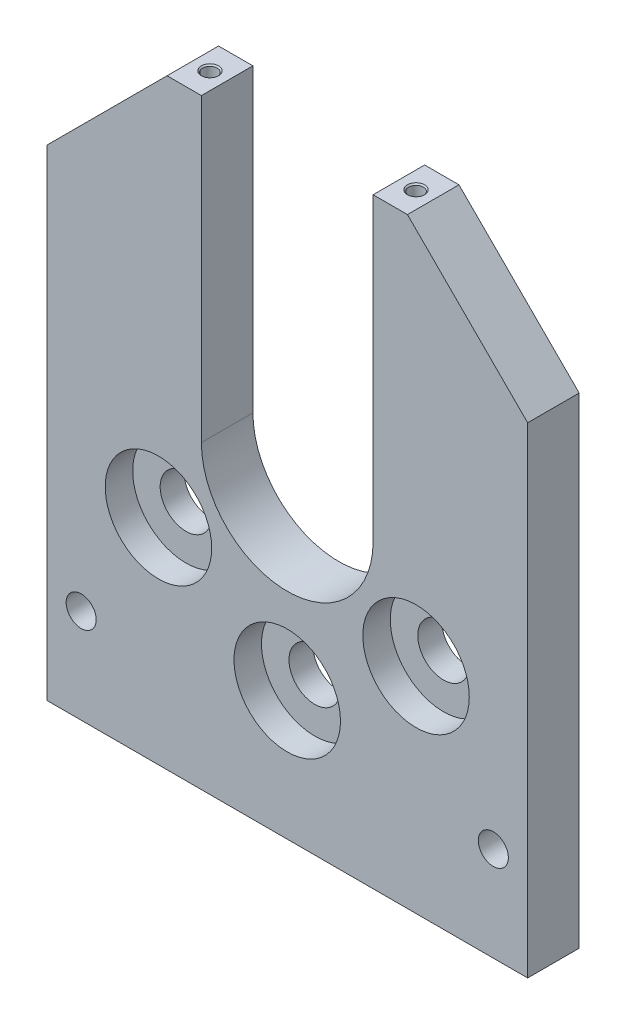
ISO-10303-21;
HEADER;
FILE_DESCRIPTION(('STEP AP214'),'2;1');
FILE_NAME('part.step','',(''),(''),'','','');
FILE_SCHEMA(('AUTOMOTIVE_DESIGN { 1 0 10303 214 1 1 1 1 }'));
ENDSEC;
DATA;
#1=APPLICATION_CONTEXT('core data for automotive mechanical design processes');
#2=APPLICATION_PROTOCOL_DEFINITION('international standard','automotive_design',2000,#1);
#3=PRODUCT_CONTEXT('',#1,'mechanical');
#4=PRODUCT('Part','Part','',(#3));
#5=PRODUCT_RELATED_PRODUCT_CATEGORY('part','',(#4));
#6=PRODUCT_DEFINITION_FORMATION('','',#4);
#7=PRODUCT_DEFINITION_CONTEXT('part definition',#1,'design');
#8=PRODUCT_DEFINITION('design','',#6,#7);
#9=PRODUCT_DEFINITION_SHAPE('','',#8);
#10=(LENGTH_UNIT() NAMED_UNIT(*) SI_UNIT(.MILLI.,.METRE.));
#11=(NAMED_UNIT(*) PLANE_ANGLE_UNIT() SI_UNIT($,.RADIAN.));
#12=(NAMED_UNIT(*) SI_UNIT($,.STERADIAN.) SOLID_ANGLE_UNIT());
#13=UNCERTAINTY_MEASURE_WITH_UNIT(LENGTH_MEASURE(1.E-05),#10,'distance_accuracy_value','');
#14=(GEOMETRIC_REPRESENTATION_CONTEXT(3) GLOBAL_UNCERTAINTY_ASSIGNED_CONTEXT((#13)) GLOBAL_UNIT_ASSIGNED_CONTEXT((#10,
#11,#12)) REPRESENTATION_CONTEXT('',''));
#15=CARTESIAN_POINT('',(0.,0.,0.));
#16=DIRECTION('',(0.,0.,1.));
#17=DIRECTION('',(1.,0.,0.));
#18=AXIS2_PLACEMENT_3D('',#15,#16,#17);
#19=CARTESIAN_POINT('',(0.,75.,-335.));
#20=DIRECTION('',(0.,0.,1.));
#21=DIRECTION('',(1.,0.,0.));
#22=AXIS2_PLACEMENT_3D('',#19,#20,#21);
#23=CYLINDRICAL_SURFACE('',#22,15.);
#24=CARTESIAN_POINT('',(0.,75.,-15.));
#25=DIRECTION('',(0.,0.,1.));
#26=DIRECTION('',(1.,0.,0.));
#27=AXIS2_PLACEMENT_3D('',#24,#25,#26);
#28=CIRCLE('',#27,15.);
#29=CARTESIAN_POINT('',(15.,75.,-15.));
#30=VERTEX_POINT('',#29);
#31=EDGE_CURVE('E227',#30,#30,#28,.T.);
#32=ORIENTED_EDGE('',*,*,#31,.F.);
#33=EDGE_LOOP('',(#32));
#34=FACE_BOUND('',#33,.T.);
#35=CARTESIAN_POINT('',(0.,75.,-1.));
#36=DIRECTION('',(0.,0.,1.));
#37=DIRECTION('',(1.,0.,0.));
#38=AXIS2_PLACEMENT_3D('',#35,#36,#37);
#39=CIRCLE('',#38,15.);
#40=CARTESIAN_POINT('',(15.,75.,-1.));
#41=VERTEX_POINT('',#40);
#42=EDGE_CURVE('E49',#41,#41,#39,.F.);
#43=ORIENTED_EDGE('',*,*,#42,.F.);
#44=EDGE_LOOP('',(#43));
#45=FACE_BOUND('',#44,.T.);
#46=ADVANCED_FACE('F44',(#34,#45),#23,.F.);
#47=CARTESIAN_POINT('',(75.,124.749371855331,-335.));
#48=DIRECTION('',(0.,0.,1.));
#49=DIRECTION('',(1.,0.,0.));
#50=AXIS2_PLACEMENT_3D('',#47,#48,#49);
#51=CYLINDRICAL_SURFACE('',#50,15.);
#52=CARTESIAN_POINT('',(75.,124.749371855331,-15.));
#53=DIRECTION('',(0.,0.,1.));
#54=DIRECTION('',(1.,0.,0.));
#55=AXIS2_PLACEMENT_3D('',#52,#53,#54);
#56=CIRCLE('',#55,15.);
#57=CARTESIAN_POINT('',(90.,124.749371855331,-15.));
#58=VERTEX_POINT('',#57);
#59=EDGE_CURVE('E231',#58,#58,#56,.T.);
#60=ORIENTED_EDGE('',*,*,#59,.F.);
#61=EDGE_LOOP('',(#60));
#62=FACE_BOUND('',#61,.T.);
#63=CARTESIAN_POINT('',(75.,124.749371855331,-1.));
#64=DIRECTION('',(0.,0.,1.));
#65=DIRECTION('',(1.,0.,0.));
#66=AXIS2_PLACEMENT_3D('',#63,#64,#65);
#67=CIRCLE('',#66,15.);
#68=CARTESIAN_POINT('',(90.,124.749371855331,-1.));
#69=VERTEX_POINT('',#68);
#70=EDGE_CURVE('E221',#69,#69,#67,.F.);
#71=ORIENTED_EDGE('',*,*,#70,.F.);
#72=EDGE_LOOP('',(#71));
#73=FACE_BOUND('',#72,.T.);
#74=ADVANCED_FACE('F314',(#62,#73),#51,.F.);
#75=CARTESIAN_POINT('',(-75.,124.749371855331,-335.));
#76=DIRECTION('',(0.,0.,1.));
#77=DIRECTION('',(1.,0.,0.));
#78=AXIS2_PLACEMENT_3D('',#75,#76,#77);
#79=CYLINDRICAL_SURFACE('',#78,15.);
#80=CARTESIAN_POINT('',(-75.,124.749371855331,-15.));
#81=DIRECTION('',(0.,0.,1.));
#82=DIRECTION('',(1.,0.,0.));
#83=AXIS2_PLACEMENT_3D('',#80,#81,#82);
#84=CIRCLE('',#83,15.);
#85=CARTESIAN_POINT('',(-60.,124.749371855331,-15.));
#86=VERTEX_POINT('',#85);
#87=EDGE_CURVE('E236',#86,#86,#84,.T.);
#88=ORIENTED_EDGE('',*,*,#87,.F.);
#89=EDGE_LOOP('',(#88));
#90=FACE_BOUND('',#89,.T.);
#91=CARTESIAN_POINT('',(-75.,124.749371855331,-1.));
#92=DIRECTION('',(0.,0.,1.));
#93=DIRECTION('',(1.,0.,0.));
#94=AXIS2_PLACEMENT_3D('',#91,#92,#93);
#95=CIRCLE('',#94,15.);
#96=CARTESIAN_POINT('',(-60.,124.749371855331,-1.));
#97=VERTEX_POINT('',#96);
#98=EDGE_CURVE('E219',#97,#97,#95,.F.);
#99=ORIENTED_EDGE('',*,*,#98,.F.);
#100=EDGE_LOOP('',(#99));
#101=FACE_BOUND('',#100,.T.);
#102=ADVANCED_FACE('F320',(#90,#101),#79,.F.);
#103=CARTESIAN_POINT('',(0.,350.,0.));
#104=DIRECTION('',(0.,1.,0.));
#105=DIRECTION('',(0.,0.,1.));
#106=AXIS2_PLACEMENT_3D('',#103,#104,#105);
#107=PLANE('',#106);
#108=CARTESIAN_POINT('',(60.,350.,0.));
#109=DIRECTION('',(0.,1.,0.));
#110=DIRECTION('',(0.,0.,1.));
#111=AXIS2_PLACEMENT_3D('',#108,#109,#110);
#112=CIRCLE('',#111,5.025);
#113=CARTESIAN_POINT('',(60.,350.,5.025));
#114=VERTEX_POINT('',#113);
#115=EDGE_CURVE('E137',#114,#114,#112,.T.);
#116=ORIENTED_EDGE('',*,*,#115,.F.);
#117=EDGE_LOOP('',(#116));
#118=FACE_BOUND('',#117,.T.);
#119=DIRECTION('',(1.,0.,0.));
#120=VECTOR('',#119,1.);
#121=CARTESIAN_POINT('',(-140.,350.,15.));
#122=LINE('',#121,#120);
#123=CARTESIAN_POINT('',(50.,350.,15.));
#124=VERTEX_POINT('',#123);
#125=CARTESIAN_POINT('',(70.,350.,15.));
#126=VERTEX_POINT('',#125);
#127=EDGE_CURVE('E177',#124,#126,#122,.T.);
#128=ORIENTED_EDGE('',*,*,#127,.T.);
#129=DIRECTION('',(0.,0.,-1.));
#130=VECTOR('',#129,1.);
#131=CARTESIAN_POINT('',(70.,350.,-15.));
#132=LINE('',#131,#130);
#133=CARTESIAN_POINT('',(70.,350.,-15.));
#134=VERTEX_POINT('',#133);
#135=EDGE_CURVE('E54',#126,#134,#132,.T.);
#136=ORIENTED_EDGE('',*,*,#135,.T.);
#137=DIRECTION('',(-1.,0.,0.));
#138=VECTOR('',#137,1.);
#139=CARTESIAN_POINT('',(-140.,350.,-15.));
#140=LINE('',#139,#138);
#141=CARTESIAN_POINT('',(50.,350.,-15.));
#142=VERTEX_POINT('',#141);
#143=EDGE_CURVE('E175',#134,#142,#140,.T.);
#144=ORIENTED_EDGE('',*,*,#143,.T.);
#145=DIRECTION('',(0.,0.,-1.));
#146=VECTOR('',#145,1.);
#147=CARTESIAN_POINT('',(50.,350.,0.));
#148=LINE('',#147,#146);
#149=EDGE_CURVE('E203',#124,#142,#148,.T.);
#150=ORIENTED_EDGE('',*,*,#149,.F.);
#151=EDGE_LOOP('',(#128,#136,#144,#150));
#152=FACE_BOUND('',#151,.T.);
#153=ADVANCED_FACE('F266',(#118,#152),#107,.T.);
#154=CARTESIAN_POINT('',(140.,350.,-15.));
#155=DIRECTION('',(-1.,0.,0.));
#156=DIRECTION('',(0.,0.,1.));
#157=AXIS2_PLACEMENT_3D('',#154,#155,#156);
#158=PLANE('',#157);
#159=DIRECTION('',(0.,-1.,0.));
#160=VECTOR('',#159,1.);
#161=CARTESIAN_POINT('',(140.,350.,-15.));
#162=LINE('',#161,#160);
#163=CARTESIAN_POINT('',(140.,280.,-15.));
#164=VERTEX_POINT('',#163);
#165=CARTESIAN_POINT('',(140.,0.,-15.));
#166=VERTEX_POINT('',#165);
#167=EDGE_CURVE('E198',#164,#166,#162,.T.);
#168=ORIENTED_EDGE('',*,*,#167,.F.);
#169=DIRECTION('',(0.,0.,1.));
#170=VECTOR('',#169,1.);
#171=CARTESIAN_POINT('',(140.,280.,15.));
#172=LINE('',#171,#170);
#173=CARTESIAN_POINT('',(140.,280.,15.));
#174=VERTEX_POINT('',#173);
#175=EDGE_CURVE('E11',#164,#174,#172,.T.);
#176=ORIENTED_EDGE('',*,*,#175,.T.);
#177=DIRECTION('',(0.,-1.,0.));
#178=VECTOR('',#177,1.);
#179=CARTESIAN_POINT('',(140.,350.,15.));
#180=LINE('',#179,#178);
#181=CARTESIAN_POINT('',(140.,0.,15.));
#182=VERTEX_POINT('',#181);
#183=EDGE_CURVE('E181',#174,#182,#180,.T.);
#184=ORIENTED_EDGE('',*,*,#183,.T.);
#185=DIRECTION('',(0.,0.,-1.));
#186=VECTOR('',#185,1.);
#187=CARTESIAN_POINT('',(140.,0.,-15.));
#188=LINE('',#187,#186);
#189=EDGE_CURVE('E174',#182,#166,#188,.T.);
#190=ORIENTED_EDGE('',*,*,#189,.T.);
#191=EDGE_LOOP('',(#168,#176,#184,#190));
#192=FACE_BOUND('',#191,.T.);
#193=ADVANCED_FACE('F365',(#192),#158,.F.);
#194=CARTESIAN_POINT('',(-140.,350.,-15.));
#195=DIRECTION('',(0.,0.,1.));
#196=DIRECTION('',(1.,0.,0.));
#197=AXIS2_PLACEMENT_3D('',#194,#195,#196);
#198=PLANE('',#197);
#199=ORIENTED_EDGE('',*,*,#87,.T.);
#200=EDGE_LOOP('',(#199));
#201=FACE_BOUND('',#200,.T.);
#202=ORIENTED_EDGE('',*,*,#59,.T.);
#203=EDGE_LOOP('',(#202));
#204=FACE_BOUND('',#203,.T.);
#205=ORIENTED_EDGE('',*,*,#31,.T.);
#206=EDGE_LOOP('',(#205));
#207=FACE_BOUND('',#206,.T.);
#208=CARTESIAN_POINT('',(-120.,55.,-15.));
#209=DIRECTION('',(0.,0.,1.));
#210=DIRECTION('',(1.,0.,0.));
#211=AXIS2_PLACEMENT_3D('',#208,#209,#210);
#212=CIRCLE('',#211,8.75000000000001);
#213=CARTESIAN_POINT('',(-111.25,55.,-15.));
#214=VERTEX_POINT('',#213);
#215=EDGE_CURVE('E253',#214,#214,#212,.T.);
#216=ORIENTED_EDGE('',*,*,#215,.T.);
#217=EDGE_LOOP('',(#216));
#218=FACE_BOUND('',#217,.T.);
#219=CARTESIAN_POINT('',(120.,55.,-15.));
#220=DIRECTION('',(0.,0.,1.));
#221=DIRECTION('',(1.,0.,0.));
#222=AXIS2_PLACEMENT_3D('',#219,#220,#221);
#223=CIRCLE('',#222,8.75);
#224=CARTESIAN_POINT('',(128.75,55.,-15.));
#225=VERTEX_POINT('',#224);
#226=EDGE_CURVE('E248',#225,#225,#223,.T.);
#227=ORIENTED_EDGE('',*,*,#226,.T.);
#228=EDGE_LOOP('',(#227));
#229=FACE_BOUND('',#228,.T.);
#230=DIRECTION('',(0.,-1.,0.));
#231=VECTOR('',#230,1.);
#232=CARTESIAN_POINT('',(-140.,350.,-15.));
#233=LINE('',#232,#231);
#234=CARTESIAN_POINT('',(-140.,280.,-15.));
#235=VERTEX_POINT('',#234);
#236=CARTESIAN_POINT('',(-140.,0.,-15.));
#237=VERTEX_POINT('',#236);
#238=EDGE_CURVE('E196',#235,#237,#233,.T.);
#239=ORIENTED_EDGE('',*,*,#238,.F.);
#240=DIRECTION('',(0.707106781186546,0.707106781186549,0.));
#241=VECTOR('',#240,1.);
#242=CARTESIAN_POINT('',(-70.0000000000001,350.,-15.));
#243=LINE('',#242,#241);
#244=CARTESIAN_POINT('',(-70.0000000000001,350.,-15.));
#245=VERTEX_POINT('',#244);
#246=EDGE_CURVE('E216',#235,#245,#243,.T.);
#247=ORIENTED_EDGE('',*,*,#246,.T.);
#248=CARTESIAN_POINT('',(-50.,350.,-15.));
#249=VERTEX_POINT('',#248);
#250=EDGE_CURVE('E178',#249,#245,#140,.T.);
#251=ORIENTED_EDGE('',*,*,#250,.F.);
#252=DIRECTION('',(0.,-1.,0.));
#253=VECTOR('',#252,1.);
#254=CARTESIAN_POINT('',(-50.,350.,-15.));
#255=LINE('',#254,#253);
#256=CARTESIAN_POINT('',(-50.,175.,-15.));
#257=VERTEX_POINT('',#256);
#258=EDGE_CURVE('E164',#249,#257,#255,.T.);
#259=ORIENTED_EDGE('',*,*,#258,.T.);
#260=CARTESIAN_POINT('',(0.,175.,-15.));
#261=DIRECTION('',(0.,0.,1.));
#262=DIRECTION('',(1.,0.,0.));
#263=AXIS2_PLACEMENT_3D('',#260,#261,#262);
#264=CIRCLE('',#263,50.);
#265=CARTESIAN_POINT('',(50.,175.,-15.));
#266=VERTEX_POINT('',#265);
#267=EDGE_CURVE('E171',#257,#266,#264,.T.);
#268=ORIENTED_EDGE('',*,*,#267,.T.);
#269=DIRECTION('',(0.,1.,0.));
#270=VECTOR('',#269,1.);
#271=CARTESIAN_POINT('',(50.,350.,-15.));
#272=LINE('',#271,#270);
#273=EDGE_CURVE('E168',#266,#142,#272,.T.);
#274=ORIENTED_EDGE('',*,*,#273,.T.);
#275=ORIENTED_EDGE('',*,*,#143,.F.);
#276=DIRECTION('',(0.707106781186546,-0.707106781186549,0.));
#277=VECTOR('',#276,1.);
#278=CARTESIAN_POINT('',(70.,350.,-15.));
#279=LINE('',#278,#277);
#280=EDGE_CURVE('E62',#134,#164,#279,.T.);
#281=ORIENTED_EDGE('',*,*,#280,.T.);
#282=ORIENTED_EDGE('',*,*,#167,.T.);
#283=DIRECTION('',(-1.,0.,0.));
#284=VECTOR('',#283,1.);
#285=CARTESIAN_POINT('',(-140.,0.,-15.));
#286=LINE('',#285,#284);
#287=EDGE_CURVE('E184',#166,#237,#286,.T.);
#288=ORIENTED_EDGE('',*,*,#287,.T.);
#289=EDGE_LOOP('',(#239,#247,#251,#259,#268,#274,#275,#281,#282,#288));
#290=FACE_BOUND('',#289,.T.);
#291=ADVANCED_FACE('F294',(#201,#204,#207,#218,#229,#290),#198,.F.);
#292=CARTESIAN_POINT('',(-140.,350.,-15.));
#293=DIRECTION('',(1.,0.,0.));
#294=DIRECTION('',(0.,0.,-1.));
#295=AXIS2_PLACEMENT_3D('',#292,#293,#294);
#296=PLANE('',#295);
#297=DIRECTION('',(0.,-1.,0.));
#298=VECTOR('',#297,1.);
#299=CARTESIAN_POINT('',(-140.,350.,15.));
#300=LINE('',#299,#298);
#301=CARTESIAN_POINT('',(-140.,280.,15.));
#302=VERTEX_POINT('',#301);
#303=CARTESIAN_POINT('',(-140.,0.,15.));
#304=VERTEX_POINT('',#303);
#305=EDGE_CURVE('E194',#302,#304,#300,.T.);
#306=ORIENTED_EDGE('',*,*,#305,.F.);
#307=DIRECTION('',(0.,0.,-1.));
#308=VECTOR('',#307,1.);
#309=CARTESIAN_POINT('',(-140.,280.,-15.));
#310=LINE('',#309,#308);
#311=EDGE_CURVE('E213',#302,#235,#310,.T.);
#312=ORIENTED_EDGE('',*,*,#311,.T.);
#313=ORIENTED_EDGE('',*,*,#238,.T.);
#314=DIRECTION('',(0.,0.,1.));
#315=VECTOR('',#314,1.);
#316=CARTESIAN_POINT('',(-140.,0.,-15.));
#317=LINE('',#316,#315);
#318=EDGE_CURVE('E187',#237,#304,#317,.T.);
#319=ORIENTED_EDGE('',*,*,#318,.T.);
#320=EDGE_LOOP('',(#306,#312,#313,#319));
#321=FACE_BOUND('',#320,.T.);
#322=ADVANCED_FACE('F280',(#321),#296,.F.);
#323=CARTESIAN_POINT('',(-140.,350.,15.));
#324=DIRECTION('',(0.,0.,-1.));
#325=DIRECTION('',(-1.,0.,0.));
#326=AXIS2_PLACEMENT_3D('',#323,#324,#325);
#327=PLANE('',#326);
#328=CARTESIAN_POINT('',(-75.,124.749371855331,15.));
#329=DIRECTION('',(0.,0.,1.));
#330=DIRECTION('',(1.,0.,0.));
#331=AXIS2_PLACEMENT_3D('',#328,#329,#330);
#332=CIRCLE('',#331,31.);
#333=CARTESIAN_POINT('',(-44.,124.749371855331,15.));
#334=VERTEX_POINT('',#333);
#335=EDGE_CURVE('E416',#334,#334,#332,.T.);
#336=ORIENTED_EDGE('',*,*,#335,.F.);
#337=EDGE_LOOP('',(#336));
#338=FACE_BOUND('',#337,.T.);
#339=CARTESIAN_POINT('',(0.,75.,15.));
#340=DIRECTION('',(0.,0.,1.));
#341=DIRECTION('',(1.,0.,0.));
#342=AXIS2_PLACEMENT_3D('',#339,#340,#341);
#343=CIRCLE('',#342,31.);
#344=CARTESIAN_POINT('',(31.,75.,15.));
#345=VERTEX_POINT('',#344);
#346=EDGE_CURVE('E419',#345,#345,#343,.T.);
#347=ORIENTED_EDGE('',*,*,#346,.F.);
#348=EDGE_LOOP('',(#347));
#349=FACE_BOUND('',#348,.T.);
#350=CARTESIAN_POINT('',(75.,124.749371855331,15.));
#351=DIRECTION('',(0.,0.,1.));
#352=DIRECTION('',(1.,0.,0.));
#353=AXIS2_PLACEMENT_3D('',#350,#351,#352);
#354=CIRCLE('',#353,31.);
#355=CARTESIAN_POINT('',(106.,124.749371855331,15.));
#356=VERTEX_POINT('',#355);
#357=EDGE_CURVE('E426',#356,#356,#354,.T.);
#358=ORIENTED_EDGE('',*,*,#357,.F.);
#359=EDGE_LOOP('',(#358));
#360=FACE_BOUND('',#359,.T.);
#361=CARTESIAN_POINT('',(-120.,55.,15.));
#362=DIRECTION('',(0.,0.,1.));
#363=DIRECTION('',(1.,0.,0.));
#364=AXIS2_PLACEMENT_3D('',#361,#362,#363);
#365=CIRCLE('',#364,8.75000000000001);
#366=CARTESIAN_POINT('',(-111.25,55.,15.));
#367=VERTEX_POINT('',#366);
#368=EDGE_CURVE('E245',#367,#367,#365,.T.);
#369=ORIENTED_EDGE('',*,*,#368,.F.);
#370=EDGE_LOOP('',(#369));
#371=FACE_BOUND('',#370,.T.);
#372=CARTESIAN_POINT('',(120.,55.,15.));
#373=DIRECTION('',(0.,0.,1.));
#374=DIRECTION('',(1.,0.,0.));
#375=AXIS2_PLACEMENT_3D('',#372,#373,#374);
#376=CIRCLE('',#375,8.75);
#377=CARTESIAN_POINT('',(128.75,55.,15.));
#378=VERTEX_POINT('',#377);
#379=EDGE_CURVE('E244',#378,#378,#376,.T.);
#380=ORIENTED_EDGE('',*,*,#379,.F.);
#381=EDGE_LOOP('',(#380));
#382=FACE_BOUND('',#381,.T.);
#383=CARTESIAN_POINT('',(-70.0000000000001,350.,15.));
#384=VERTEX_POINT('',#383);
#385=CARTESIAN_POINT('',(-50.,350.,15.));
#386=VERTEX_POINT('',#385);
#387=EDGE_CURVE('E179',#384,#386,#122,.T.);
#388=ORIENTED_EDGE('',*,*,#387,.F.);
#389=DIRECTION('',(-0.707106781186546,-0.707106781186549,0.));
#390=VECTOR('',#389,1.);
#391=CARTESIAN_POINT('',(-70.0000000000001,350.,15.));
#392=LINE('',#391,#390);
#393=EDGE_CURVE('E211',#384,#302,#392,.T.);
#394=ORIENTED_EDGE('',*,*,#393,.T.);
#395=ORIENTED_EDGE('',*,*,#305,.T.);
#396=DIRECTION('',(1.,0.,0.));
#397=VECTOR('',#396,1.);
#398=CARTESIAN_POINT('',(-140.,0.,15.));
#399=LINE('',#398,#397);
#400=EDGE_CURVE('E190',#304,#182,#399,.T.);
#401=ORIENTED_EDGE('',*,*,#400,.T.);
#402=ORIENTED_EDGE('',*,*,#183,.F.);
#403=DIRECTION('',(-0.707106781186546,0.707106781186549,0.));
#404=VECTOR('',#403,1.);
#405=CARTESIAN_POINT('',(70.,350.,15.));
#406=LINE('',#405,#404);
#407=EDGE_CURVE('E209',#174,#126,#406,.T.);
#408=ORIENTED_EDGE('',*,*,#407,.T.);
#409=ORIENTED_EDGE('',*,*,#127,.F.);
#410=DIRECTION('',(0.,1.,0.));
#411=VECTOR('',#410,1.);
#412=CARTESIAN_POINT('',(50.,350.,15.));
#413=LINE('',#412,#411);
#414=CARTESIAN_POINT('',(50.,175.,15.));
#415=VERTEX_POINT('',#414);
#416=EDGE_CURVE('E159',#415,#124,#413,.T.);
#417=ORIENTED_EDGE('',*,*,#416,.F.);
#418=CARTESIAN_POINT('',(0.,175.,15.));
#419=DIRECTION('',(0.,0.,1.));
#420=DIRECTION('',(1.,0.,0.));
#421=AXIS2_PLACEMENT_3D('',#418,#419,#420);
#422=CIRCLE('',#421,50.);
#423=CARTESIAN_POINT('',(-50.,175.,15.));
#424=VERTEX_POINT('',#423);
#425=EDGE_CURVE('E156',#424,#415,#422,.T.);
#426=ORIENTED_EDGE('',*,*,#425,.F.);
#427=DIRECTION('',(0.,-1.,0.));
#428=VECTOR('',#427,1.);
#429=CARTESIAN_POINT('',(-50.,350.,15.));
#430=LINE('',#429,#428);
#431=EDGE_CURVE('E153',#386,#424,#430,.T.);
#432=ORIENTED_EDGE('',*,*,#431,.F.);
#433=EDGE_LOOP('',(#388,#394,#395,#401,#402,#408,#409,#417,#426,#432));
#434=FACE_BOUND('',#433,.T.);
#435=ADVANCED_FACE('F264',(#338,#349,#360,#371,#382,#434),#327,.F.);
#436=CARTESIAN_POINT('',(-60.,350.,0.));
#437=DIRECTION('',(0.,1.,0.));
#438=DIRECTION('',(0.,0.,1.));
#439=AXIS2_PLACEMENT_3D('',#436,#437,#438);
#440=CIRCLE('',#439,5.025);
#441=CARTESIAN_POINT('',(-60.,350.,5.025));
#442=VERTEX_POINT('',#441);
#443=EDGE_CURVE('E144',#442,#442,#440,.T.);
#444=ORIENTED_EDGE('',*,*,#443,.F.);
#445=EDGE_LOOP('',(#444));
#446=FACE_BOUND('',#445,.T.);
#447=ORIENTED_EDGE('',*,*,#250,.T.);
#448=DIRECTION('',(0.,0.,1.));
#449=VECTOR('',#448,1.);
#450=CARTESIAN_POINT('',(-70.0000000000001,350.,15.));
#451=LINE('',#450,#449);
#452=EDGE_CURVE('E206',#245,#384,#451,.T.);
#453=ORIENTED_EDGE('',*,*,#452,.T.);
#454=ORIENTED_EDGE('',*,*,#387,.T.);
#455=DIRECTION('',(0.,0.,1.));
#456=VECTOR('',#455,1.);
#457=CARTESIAN_POINT('',(-50.,350.,0.));
#458=LINE('',#457,#456);
#459=EDGE_CURVE('E200',#249,#386,#458,.T.);
#460=ORIENTED_EDGE('',*,*,#459,.F.);
#461=EDGE_LOOP('',(#447,#453,#454,#460));
#462=FACE_BOUND('',#461,.T.);
#463=ADVANCED_FACE('F260',(#446,#462),#107,.T.);
#464=CARTESIAN_POINT('',(0.,0.,0.));
#465=DIRECTION('',(0.,1.,0.));
#466=DIRECTION('',(0.,0.,1.));
#467=AXIS2_PLACEMENT_3D('',#464,#465,#466);
#468=PLANE('',#467);
#469=ORIENTED_EDGE('',*,*,#189,.F.);
#470=ORIENTED_EDGE('',*,*,#400,.F.);
#471=ORIENTED_EDGE('',*,*,#318,.F.);
#472=ORIENTED_EDGE('',*,*,#287,.F.);
#473=EDGE_LOOP('',(#469,#470,#471,#472));
#474=FACE_BOUND('',#473,.T.);
#475=ADVANCED_FACE('F263',(#474),#468,.F.);
#476=CARTESIAN_POINT('',(0.,175.,-335.));
#477=DIRECTION('',(0.,0.,1.));
#478=DIRECTION('',(1.,0.,0.));
#479=AXIS2_PLACEMENT_3D('',#476,#477,#478);
#480=CYLINDRICAL_SURFACE('',#479,50.);
#481=DIRECTION('',(0.,0.,1.));
#482=VECTOR('',#481,1.);
#483=CARTESIAN_POINT('',(-50.,175.,-335.));
#484=LINE('',#483,#482);
#485=EDGE_CURVE('E161',#257,#424,#484,.T.);
#486=ORIENTED_EDGE('',*,*,#485,.T.);
#487=ORIENTED_EDGE('',*,*,#425,.T.);
#488=DIRECTION('',(0.,0.,1.));
#489=VECTOR('',#488,1.);
#490=CARTESIAN_POINT('',(50.,175.,-335.));
#491=LINE('',#490,#489);
#492=EDGE_CURVE('E162',#266,#415,#491,.T.);
#493=ORIENTED_EDGE('',*,*,#492,.F.);
#494=ORIENTED_EDGE('',*,*,#267,.F.);
#495=EDGE_LOOP('',(#486,#487,#493,#494));
#496=FACE_BOUND('',#495,.T.);
#497=ADVANCED_FACE('F299',(#496),#480,.F.);
#498=CARTESIAN_POINT('',(50.,350.,-335.));
#499=DIRECTION('',(1.,0.,0.));
#500=DIRECTION('',(0.,1.,0.));
#501=AXIS2_PLACEMENT_3D('',#498,#499,#500);
#502=PLANE('',#501);
#503=ORIENTED_EDGE('',*,*,#492,.T.);
#504=ORIENTED_EDGE('',*,*,#416,.T.);
#505=ORIENTED_EDGE('',*,*,#149,.T.);
#506=ORIENTED_EDGE('',*,*,#273,.F.);
#507=EDGE_LOOP('',(#503,#504,#505,#506));
#508=FACE_BOUND('',#507,.T.);
#509=ADVANCED_FACE('F297',(#508),#502,.F.);
#510=CARTESIAN_POINT('',(-50.,350.,-335.));
#511=DIRECTION('',(-1.,0.,0.));
#512=DIRECTION('',(0.,-1.,0.));
#513=AXIS2_PLACEMENT_3D('',#510,#511,#512);
#514=PLANE('',#513);
#515=ORIENTED_EDGE('',*,*,#459,.T.);
#516=ORIENTED_EDGE('',*,*,#431,.T.);
#517=ORIENTED_EDGE('',*,*,#485,.F.);
#518=ORIENTED_EDGE('',*,*,#258,.F.);
#519=EDGE_LOOP('',(#515,#516,#517,#518));
#520=FACE_BOUND('',#519,.T.);
#521=ADVANCED_FACE('F304',(#520),#514,.F.);
#522=CARTESIAN_POINT('',(-70.0000000000001,350.,0.));
#523=DIRECTION('',(-0.707106781186549,0.707106781186546,0.));
#524=DIRECTION('',(0.,0.,-1.));
#525=AXIS2_PLACEMENT_3D('',#522,#523,#524);
#526=PLANE('',#525);
#527=ORIENTED_EDGE('',*,*,#246,.F.);
#528=ORIENTED_EDGE('',*,*,#311,.F.);
#529=ORIENTED_EDGE('',*,*,#393,.F.);
#530=ORIENTED_EDGE('',*,*,#452,.F.);
#531=EDGE_LOOP('',(#527,#528,#529,#530));
#532=FACE_BOUND('',#531,.T.);
#533=ADVANCED_FACE('F274',(#532),#526,.T.);
#534=CARTESIAN_POINT('',(70.,350.,0.));
#535=DIRECTION('',(0.707106781186549,0.707106781186546,0.));
#536=DIRECTION('',(0.,0.,1.));
#537=AXIS2_PLACEMENT_3D('',#534,#535,#536);
#538=PLANE('',#537);
#539=ORIENTED_EDGE('',*,*,#407,.F.);
#540=ORIENTED_EDGE('',*,*,#175,.F.);
#541=ORIENTED_EDGE('',*,*,#280,.F.);
#542=ORIENTED_EDGE('',*,*,#135,.F.);
#543=EDGE_LOOP('',(#539,#540,#541,#542));
#544=FACE_BOUND('',#543,.T.);
#545=ADVANCED_FACE('F47',(#544),#538,.T.);
#546=CARTESIAN_POINT('',(60.,325.5,0.));
#547=DIRECTION('',(0.,1.,0.));
#548=DIRECTION('',(0.,0.,1.));
#549=AXIS2_PLACEMENT_3D('',#546,#547,#548);
#550=CONICAL_SURFACE('',#549,4.24999999999999,1.02974425867664);
#551=CARTESIAN_POINT('',(60.,322.946342369133,0.));
#552=VERTEX_POINT('',#551);
#553=VERTEX_LOOP('',#552);
#554=FACE_BOUND('',#553,.T.);
#555=CARTESIAN_POINT('',(60.,325.5,0.));
#556=DIRECTION('',(0.,1.,0.));
#557=DIRECTION('',(0.,0.,1.));
#558=AXIS2_PLACEMENT_3D('',#555,#556,#557);
#559=CIRCLE('',#558,4.24999999999999);
#560=CARTESIAN_POINT('',(60.,325.5,4.24999999999999));
#561=VERTEX_POINT('',#560);
#562=EDGE_CURVE('E150',#561,#561,#559,.T.);
#563=ORIENTED_EDGE('',*,*,#562,.T.);
#564=EDGE_LOOP('',(#563));
#565=FACE_BOUND('',#564,.T.);
#566=ADVANCED_FACE('F346',(#554,#565),#550,.F.);
#567=CARTESIAN_POINT('',(60.,350.,0.));
#568=DIRECTION('',(0.,1.,0.));
#569=DIRECTION('',(0.,0.,1.));
#570=AXIS2_PLACEMENT_3D('',#567,#568,#569);
#571=CYLINDRICAL_SURFACE('',#570,4.24999999999999);
#572=ORIENTED_EDGE('',*,*,#562,.F.);
#573=EDGE_LOOP('',(#572));
#574=FACE_BOUND('',#573,.T.);
#575=CARTESIAN_POINT('',(60.,349.225,0.));
#576=DIRECTION('',(0.,1.,0.));
#577=DIRECTION('',(0.,0.,1.));
#578=AXIS2_PLACEMENT_3D('',#575,#576,#577);
#579=CIRCLE('',#578,4.24999999999999);
#580=CARTESIAN_POINT('',(60.,349.225,4.24999999999999));
#581=VERTEX_POINT('',#580);
#582=EDGE_CURVE('E141',#581,#581,#579,.T.);
#583=ORIENTED_EDGE('',*,*,#582,.T.);
#584=EDGE_LOOP('',(#583));
#585=FACE_BOUND('',#584,.T.);
#586=ADVANCED_FACE('F342',(#574,#585),#571,.F.);
#587=CARTESIAN_POINT('',(60.,350.,0.));
#588=DIRECTION('',(0.,1.,0.));
#589=DIRECTION('',(0.,0.,1.));
#590=AXIS2_PLACEMENT_3D('',#587,#588,#589);
#591=CONICAL_SURFACE('',#590,5.025,0.785398163397439);
#592=ORIENTED_EDGE('',*,*,#582,.F.);
#593=EDGE_LOOP('',(#592));
#594=FACE_BOUND('',#593,.T.);
#595=ORIENTED_EDGE('',*,*,#115,.T.);
#596=EDGE_LOOP('',(#595));
#597=FACE_BOUND('',#596,.T.);
#598=ADVANCED_FACE('F131',(#594,#597),#591,.F.);
#599=CARTESIAN_POINT('',(-60.,325.5,0.));
#600=DIRECTION('',(0.,1.,0.));
#601=DIRECTION('',(0.,0.,1.));
#602=AXIS2_PLACEMENT_3D('',#599,#600,#601);
#603=CONICAL_SURFACE('',#602,4.24999999999999,1.02974425867664);
#604=CARTESIAN_POINT('',(-60.,322.946342369133,0.));
#605=VERTEX_POINT('',#604);
#606=VERTEX_LOOP('',#605);
#607=FACE_BOUND('',#606,.T.);
#608=CARTESIAN_POINT('',(-60.,325.5,0.));
#609=DIRECTION('',(0.,1.,0.));
#610=DIRECTION('',(0.,0.,1.));
#611=AXIS2_PLACEMENT_3D('',#608,#609,#610);
#612=CIRCLE('',#611,4.24999999999999);
#613=CARTESIAN_POINT('',(-60.,325.5,4.24999999999999));
#614=VERTEX_POINT('',#613);
#615=EDGE_CURVE('E135',#614,#614,#612,.T.);
#616=ORIENTED_EDGE('',*,*,#615,.T.);
#617=EDGE_LOOP('',(#616));
#618=FACE_BOUND('',#617,.T.);
#619=ADVANCED_FACE('F127',(#607,#618),#603,.F.);
#620=CARTESIAN_POINT('',(-60.,350.,0.));
#621=DIRECTION('',(0.,1.,0.));
#622=DIRECTION('',(0.,0.,1.));
#623=AXIS2_PLACEMENT_3D('',#620,#621,#622);
#624=CYLINDRICAL_SURFACE('',#623,4.24999999999999);
#625=ORIENTED_EDGE('',*,*,#615,.F.);
#626=EDGE_LOOP('',(#625));
#627=FACE_BOUND('',#626,.T.);
#628=CARTESIAN_POINT('',(-60.,349.225,0.));
#629=DIRECTION('',(0.,1.,0.));
#630=DIRECTION('',(0.,0.,1.));
#631=AXIS2_PLACEMENT_3D('',#628,#629,#630);
#632=CIRCLE('',#631,4.24999999999999);
#633=CARTESIAN_POINT('',(-60.,349.225,4.24999999999999));
#634=VERTEX_POINT('',#633);
#635=EDGE_CURVE('E138',#634,#634,#632,.T.);
#636=ORIENTED_EDGE('',*,*,#635,.T.);
#637=EDGE_LOOP('',(#636));
#638=FACE_BOUND('',#637,.T.);
#639=ADVANCED_FACE('F130',(#627,#638),#624,.F.);
#640=CARTESIAN_POINT('',(-60.,350.,0.));
#641=DIRECTION('',(0.,1.,0.));
#642=DIRECTION('',(0.,0.,1.));
#643=AXIS2_PLACEMENT_3D('',#640,#641,#642);
#644=CONICAL_SURFACE('',#643,5.025,0.785398163397439);
#645=ORIENTED_EDGE('',*,*,#635,.F.);
#646=EDGE_LOOP('',(#645));
#647=FACE_BOUND('',#646,.T.);
#648=ORIENTED_EDGE('',*,*,#443,.T.);
#649=EDGE_LOOP('',(#648));
#650=FACE_BOUND('',#649,.T.);
#651=ADVANCED_FACE('F258',(#647,#650),#644,.F.);
#652=CARTESIAN_POINT('',(120.,55.,-335.));
#653=DIRECTION('',(0.,0.,1.));
#654=DIRECTION('',(1.,0.,0.));
#655=AXIS2_PLACEMENT_3D('',#652,#653,#654);
#656=CYLINDRICAL_SURFACE('',#655,8.75);
#657=ORIENTED_EDGE('',*,*,#379,.T.);
#658=EDGE_LOOP('',(#657));
#659=FACE_BOUND('',#658,.T.);
#660=ORIENTED_EDGE('',*,*,#226,.F.);
#661=EDGE_LOOP('',(#660));
#662=FACE_BOUND('',#661,.T.);
#663=ADVANCED_FACE('F330',(#659,#662),#656,.F.);
#664=CARTESIAN_POINT('',(-120.,55.,-335.));
#665=DIRECTION('',(0.,0.,1.));
#666=DIRECTION('',(1.,0.,0.));
#667=AXIS2_PLACEMENT_3D('',#664,#665,#666);
#668=CYLINDRICAL_SURFACE('',#667,8.75000000000001);
#669=ORIENTED_EDGE('',*,*,#368,.T.);
#670=EDGE_LOOP('',(#669));
#671=FACE_BOUND('',#670,.T.);
#672=ORIENTED_EDGE('',*,*,#215,.F.);
#673=EDGE_LOOP('',(#672));
#674=FACE_BOUND('',#673,.T.);
#675=ADVANCED_FACE('F326',(#671,#674),#668,.F.);
#676=CARTESIAN_POINT('',(-75.,124.749371855331,-1.00000000000001));
#677=DIRECTION('',(0.,0.,1.));
#678=DIRECTION('',(1.,0.,0.));
#679=AXIS2_PLACEMENT_3D('',#676,#677,#678);
#680=PLANE('',#679);
#681=CARTESIAN_POINT('',(-75.,124.749371855331,-1.00000000000001));
#682=DIRECTION('',(0.,0.,1.));
#683=DIRECTION('',(1.,0.,0.));
#684=AXIS2_PLACEMENT_3D('',#681,#682,#683);
#685=CIRCLE('',#684,31.);
#686=CARTESIAN_POINT('',(-44.,124.749371855331,-1.00000000000001));
#687=VERTEX_POINT('',#686);
#688=EDGE_CURVE('E222',#687,#687,#685,.T.);
#689=ORIENTED_EDGE('',*,*,#688,.T.);
#690=EDGE_LOOP('',(#689));
#691=FACE_BOUND('',#690,.T.);
#692=ORIENTED_EDGE('',*,*,#98,.T.);
#693=EDGE_LOOP('',(#692));
#694=FACE_BOUND('',#693,.T.);
#695=ADVANCED_FACE('F329',(#691,#694),#680,.T.);
#696=CARTESIAN_POINT('',(-75.,124.749371855331,-1.00000000000001));
#697=DIRECTION('',(0.,0.,1.));
#698=DIRECTION('',(1.,0.,0.));
#699=AXIS2_PLACEMENT_3D('',#696,#697,#698);
#700=CYLINDRICAL_SURFACE('',#699,31.);
#701=ORIENTED_EDGE('',*,*,#688,.F.);
#702=EDGE_LOOP('',(#701));
#703=FACE_BOUND('',#702,.T.);
#704=ORIENTED_EDGE('',*,*,#335,.T.);
#705=EDGE_LOOP('',(#704));
#706=FACE_BOUND('',#705,.T.);
#707=ADVANCED_FACE('F392',(#703,#706),#700,.F.);
#708=CARTESIAN_POINT('',(75.,124.749371855331,-1.00000000000001));
#709=DIRECTION('',(0.,0.,1.));
#710=DIRECTION('',(1.,0.,0.));
#711=AXIS2_PLACEMENT_3D('',#708,#709,#710);
#712=PLANE('',#711);
#713=CARTESIAN_POINT('',(75.,124.749371855331,-1.00000000000001));
#714=DIRECTION('',(0.,0.,1.));
#715=DIRECTION('',(1.,0.,0.));
#716=AXIS2_PLACEMENT_3D('',#713,#714,#715);
#717=CIRCLE('',#716,31.);
#718=CARTESIAN_POINT('',(106.,124.749371855331,-1.00000000000001));
#719=VERTEX_POINT('',#718);
#720=EDGE_CURVE('E239',#719,#719,#717,.T.);
#721=ORIENTED_EDGE('',*,*,#720,.T.);
#722=EDGE_LOOP('',(#721));
#723=FACE_BOUND('',#722,.T.);
#724=ORIENTED_EDGE('',*,*,#70,.T.);
#725=EDGE_LOOP('',(#724));
#726=FACE_BOUND('',#725,.T.);
#727=ADVANCED_FACE('F388',(#723,#726),#712,.T.);
#728=CARTESIAN_POINT('',(75.,124.749371855331,-1.00000000000001));
#729=DIRECTION('',(0.,0.,1.));
#730=DIRECTION('',(1.,0.,0.));
#731=AXIS2_PLACEMENT_3D('',#728,#729,#730);
#732=CYLINDRICAL_SURFACE('',#731,31.);
#733=ORIENTED_EDGE('',*,*,#720,.F.);
#734=EDGE_LOOP('',(#733));
#735=FACE_BOUND('',#734,.T.);
#736=ORIENTED_EDGE('',*,*,#357,.T.);
#737=EDGE_LOOP('',(#736));
#738=FACE_BOUND('',#737,.T.);
#739=ADVANCED_FACE('F391',(#735,#738),#732,.F.);
#740=CARTESIAN_POINT('',(0.,75.,-1.00000000000001));
#741=DIRECTION('',(0.,0.,1.));
#742=DIRECTION('',(1.,0.,0.));
#743=AXIS2_PLACEMENT_3D('',#740,#741,#742);
#744=PLANE('',#743);
#745=CARTESIAN_POINT('',(0.,75.,-1.00000000000001));
#746=DIRECTION('',(0.,0.,1.));
#747=DIRECTION('',(1.,0.,0.));
#748=AXIS2_PLACEMENT_3D('',#745,#746,#747);
#749=CIRCLE('',#748,31.);
#750=CARTESIAN_POINT('',(31.,75.,-1.00000000000001));
#751=VERTEX_POINT('',#750);
#752=EDGE_CURVE('E424',#751,#751,#749,.T.);
#753=ORIENTED_EDGE('',*,*,#752,.T.);
#754=EDGE_LOOP('',(#753));
#755=FACE_BOUND('',#754,.T.);
#756=ORIENTED_EDGE('',*,*,#42,.T.);
#757=EDGE_LOOP('',(#756));
#758=FACE_BOUND('',#757,.T.);
#759=ADVANCED_FACE('F396',(#755,#758),#744,.T.);
#760=CARTESIAN_POINT('',(0.,75.,-1.00000000000001));
#761=DIRECTION('',(0.,0.,1.));
#762=DIRECTION('',(1.,0.,0.));
#763=AXIS2_PLACEMENT_3D('',#760,#761,#762);
#764=CYLINDRICAL_SURFACE('',#763,31.);
#765=ORIENTED_EDGE('',*,*,#752,.F.);
#766=EDGE_LOOP('',(#765));
#767=FACE_BOUND('',#766,.T.);
#768=ORIENTED_EDGE('',*,*,#346,.T.);
#769=EDGE_LOOP('',(#768));
#770=FACE_BOUND('',#769,.T.);
#771=ADVANCED_FACE('F400',(#767,#770),#764,.F.);
#772=CLOSED_SHELL('',(#46,#74,#102,#153,#193,#291,#322,#435,#463,#475,#497,#509,#521,#533,#545,
#566,#586,#598,#619,#639,#651,#663,#675,#695,#707,#727,#739,#759,#771));
#773=MANIFOLD_SOLID_BREP('B2',#772);
#774=ADVANCED_BREP_SHAPE_REPRESENTATION('',(#18,#773),#14);
#775=SHAPE_DEFINITION_REPRESENTATION(#9,#774);
ENDSEC;
END-ISO-10303-21;
